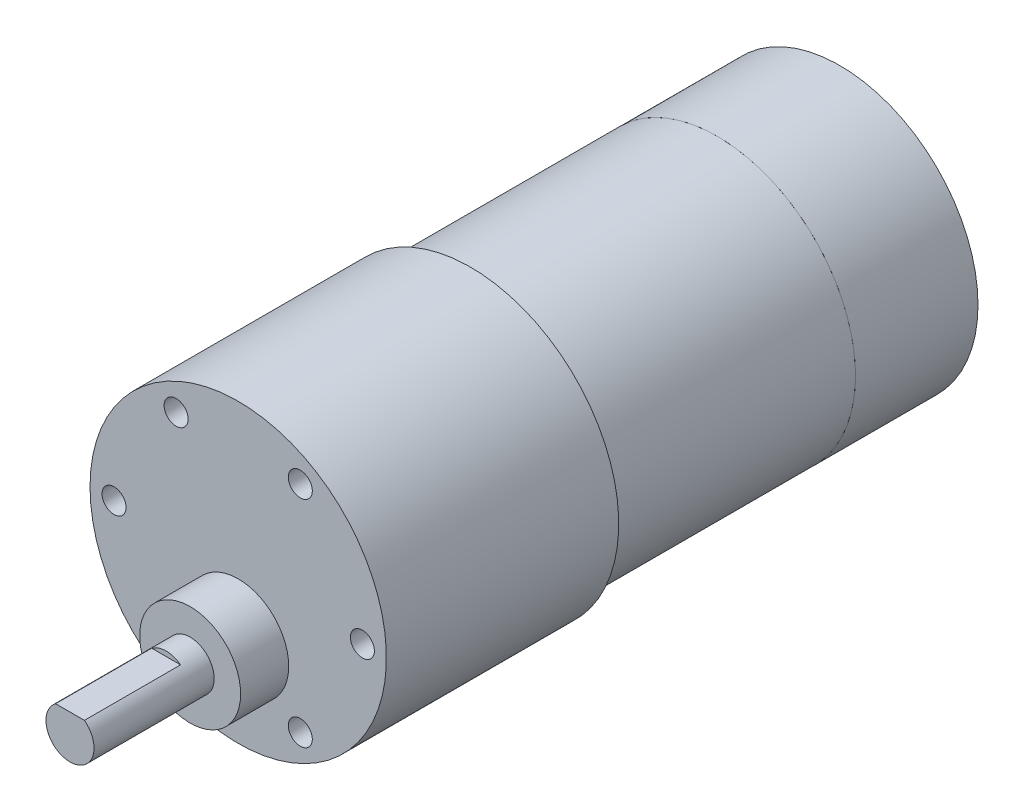
ISO-10303-21;
HEADER;
FILE_DESCRIPTION(('STEP AP214'),'2;1');
FILE_NAME('part.step','',(''),(''),'','','');
FILE_SCHEMA(('AUTOMOTIVE_DESIGN { 1 0 10303 214 1 1 1 1 }'));
ENDSEC;
DATA;
#1=APPLICATION_CONTEXT('core data for automotive mechanical design processes');
#2=APPLICATION_PROTOCOL_DEFINITION('international standard','automotive_design',2000,#1);
#3=PRODUCT_CONTEXT('',#1,'mechanical');
#4=PRODUCT('Part','Part','',(#3));
#5=PRODUCT_RELATED_PRODUCT_CATEGORY('part','',(#4));
#6=PRODUCT_DEFINITION_FORMATION('','',#4);
#7=PRODUCT_DEFINITION_CONTEXT('part definition',#1,'design');
#8=PRODUCT_DEFINITION('design','',#6,#7);
#9=PRODUCT_DEFINITION_SHAPE('','',#8);
#10=(LENGTH_UNIT() NAMED_UNIT(*) SI_UNIT(.MILLI.,.METRE.));
#11=(NAMED_UNIT(*) PLANE_ANGLE_UNIT() SI_UNIT($,.RADIAN.));
#12=(NAMED_UNIT(*) SI_UNIT($,.STERADIAN.) SOLID_ANGLE_UNIT());
#13=UNCERTAINTY_MEASURE_WITH_UNIT(LENGTH_MEASURE(1.E-05),#10,'distance_accuracy_value','');
#14=(GEOMETRIC_REPRESENTATION_CONTEXT(3) GLOBAL_UNCERTAINTY_ASSIGNED_CONTEXT((#13)) GLOBAL_UNIT_ASSIGNED_CONTEXT((#10,
#11,#12)) REPRESENTATION_CONTEXT('',''));
#15=CARTESIAN_POINT('',(0.,0.,0.));
#16=DIRECTION('',(0.,0.,1.));
#17=DIRECTION('',(1.,0.,0.));
#18=AXIS2_PLACEMENT_3D('',#15,#16,#17);
#19=CARTESIAN_POINT('',(-14.528654225032,-2.01102840967923,-5.8));
#20=DIRECTION('',(0.,0.,-1.));
#21=DIRECTION('',(-1.,0.,0.));
#22=AXIS2_PLACEMENT_3D('',#19,#20,#21);
#23=CYLINDRICAL_SURFACE('',#22,17.25);
#24=CARTESIAN_POINT('',(-14.528654225032,-2.01102840967923,-5.8));
#25=DIRECTION('',(0.,0.,1.));
#26=DIRECTION('',(1.,0.,0.));
#27=AXIS2_PLACEMENT_3D('',#24,#25,#26);
#28=CIRCLE('',#27,17.25);
#29=CARTESIAN_POINT('',(2.72134577496796,-2.01102840967923,-5.8));
#30=VERTEX_POINT('',#29);
#31=EDGE_CURVE('P0_E9',#30,#30,#28,.T.);
#32=ORIENTED_EDGE('',*,*,#31,.F.);
#33=EDGE_LOOP('',(#32));
#34=FACE_BOUND('',#33,.T.);
#35=CARTESIAN_POINT('',(-14.528654225032,-2.01102840967923,-21.1));
#36=DIRECTION('',(0.,0.,1.));
#37=DIRECTION('',(1.,0.,0.));
#38=AXIS2_PLACEMENT_3D('',#35,#36,#37);
#39=CIRCLE('',#38,17.25);
#40=CARTESIAN_POINT('',(2.72134577496796,-2.01102840967923,-21.1));
#41=VERTEX_POINT('',#40);
#42=EDGE_CURVE('P0_E16',#41,#41,#39,.T.);
#43=ORIENTED_EDGE('',*,*,#42,.T.);
#44=EDGE_LOOP('',(#43));
#45=FACE_BOUND('',#44,.T.);
#46=ADVANCED_FACE('P0_F13',(#34,#45),#23,.T.);
#47=CARTESIAN_POINT('',(-14.528654225032,-2.01102840967923,-5.8));
#48=DIRECTION('',(0.,0.,1.));
#49=DIRECTION('',(1.,0.,0.));
#50=AXIS2_PLACEMENT_3D('',#47,#48,#49);
#51=PLANE('',#50);
#52=ORIENTED_EDGE('',*,*,#31,.T.);
#53=EDGE_LOOP('',(#52));
#54=FACE_BOUND('',#53,.T.);
#55=ADVANCED_FACE('P0_F28',(#54),#51,.T.);
#56=CARTESIAN_POINT('',(-14.528654225032,-2.01102840967923,-21.1));
#57=DIRECTION('',(0.,0.,1.));
#58=DIRECTION('',(1.,0.,0.));
#59=AXIS2_PLACEMENT_3D('',#56,#57,#58);
#60=PLANE('',#59);
#61=ORIENTED_EDGE('',*,*,#42,.F.);
#62=EDGE_LOOP('',(#61));
#63=FACE_BOUND('',#62,.T.);
#64=ADVANCED_FACE('P0_F26',(#63),#60,.F.);
#65=CLOSED_SHELL('',(#46,#55,#64));
#66=MANIFOLD_SOLID_BREP('P0_B1',#65);
#67=CARTESIAN_POINT('',(-14.528654225032,-2.01102840967923,54.));
#68=DIRECTION('',(0.,0.,-1.));
#69=DIRECTION('',(-1.,0.,0.));
#70=AXIS2_PLACEMENT_3D('',#67,#68,#69);
#71=CYLINDRICAL_SURFACE('',#70,18.5);
#72=CARTESIAN_POINT('',(-14.528654225032,-2.01102840967923,54.));
#73=DIRECTION('',(0.,0.,1.));
#74=DIRECTION('',(1.,0.,0.));
#75=AXIS2_PLACEMENT_3D('',#72,#73,#74);
#76=CIRCLE('',#75,18.5);
#77=CARTESIAN_POINT('',(-33.028654225032,-2.01102840967923,54.));
#78=VERTEX_POINT('',#77);
#79=EDGE_CURVE('P1_E65',#78,#78,#76,.T.);
#80=CARTESIAN_POINT('',(-14.528654225032,-2.01102840967923,25.));
#81=DIRECTION('',(0.,0.,1.));
#82=DIRECTION('',(1.,0.,0.));
#83=AXIS2_PLACEMENT_3D('',#80,#81,#82);
#84=CIRCLE('',#83,18.5);
#85=CARTESIAN_POINT('',(-33.028654225032,-2.01102840967923,25.));
#86=VERTEX_POINT('',#85);
#87=EDGE_CURVE('P1_E56',#86,#86,#84,.T.);
#88=CARTESIAN_POINT('',(-33.028654225032,-2.01102840967923,54.));
#89=CARTESIAN_POINT('',(-33.028654225032,-2.01102840967923,53.6979166666667));
#90=CARTESIAN_POINT('',(-33.028654225032,-2.01102840967923,53.3958333333333));
#91=CARTESIAN_POINT('',(-33.028654225032,-2.01102840967923,52.7916666666667));
#92=CARTESIAN_POINT('',(-33.028654225032,-2.01102840967923,52.4895833333333));
#93=CARTESIAN_POINT('',(-33.028654225032,-2.01102840967923,51.8854166666667));
#94=CARTESIAN_POINT('',(-33.028654225032,-2.01102840967923,51.5833333333333));
#95=CARTESIAN_POINT('',(-33.028654225032,-2.01102840967923,50.9791666666667));
#96=CARTESIAN_POINT('',(-33.028654225032,-2.01102840967923,50.6770833333333));
#97=CARTESIAN_POINT('',(-33.028654225032,-2.01102840967923,50.0729166666667));
#98=CARTESIAN_POINT('',(-33.028654225032,-2.01102840967923,49.7708333333333));
#99=CARTESIAN_POINT('',(-33.028654225032,-2.01102840967923,49.1666666666667));
#100=CARTESIAN_POINT('',(-33.028654225032,-2.01102840967923,48.8645833333333));
#101=CARTESIAN_POINT('',(-33.028654225032,-2.01102840967923,48.2604166666667));
#102=CARTESIAN_POINT('',(-33.028654225032,-2.01102840967923,47.9583333333333));
#103=CARTESIAN_POINT('',(-33.028654225032,-2.01102840967923,47.3541666666667));
#104=CARTESIAN_POINT('',(-33.028654225032,-2.01102840967923,47.0520833333333));
#105=CARTESIAN_POINT('',(-33.028654225032,-2.01102840967923,46.4479166666667));
#106=CARTESIAN_POINT('',(-33.028654225032,-2.01102840967923,46.1458333333333));
#107=CARTESIAN_POINT('',(-33.028654225032,-2.01102840967923,45.5416666666667));
#108=CARTESIAN_POINT('',(-33.028654225032,-2.01102840967923,45.2395833333333));
#109=CARTESIAN_POINT('',(-33.028654225032,-2.01102840967923,44.6354166666667));
#110=CARTESIAN_POINT('',(-33.028654225032,-2.01102840967923,44.3333333333333));
#111=CARTESIAN_POINT('',(-33.028654225032,-2.01102840967923,43.7291666666667));
#112=CARTESIAN_POINT('',(-33.028654225032,-2.01102840967923,43.4270833333333));
#113=CARTESIAN_POINT('',(-33.028654225032,-2.01102840967923,42.8229166666667));
#114=CARTESIAN_POINT('',(-33.028654225032,-2.01102840967923,42.5208333333333));
#115=CARTESIAN_POINT('',(-33.028654225032,-2.01102840967923,41.9166666666667));
#116=CARTESIAN_POINT('',(-33.028654225032,-2.01102840967923,41.6145833333333));
#117=CARTESIAN_POINT('',(-33.028654225032,-2.01102840967923,41.0104166666667));
#118=CARTESIAN_POINT('',(-33.028654225032,-2.01102840967923,40.7083333333333));
#119=CARTESIAN_POINT('',(-33.028654225032,-2.01102840967923,40.1041666666667));
#120=CARTESIAN_POINT('',(-33.028654225032,-2.01102840967923,39.8020833333333));
#121=CARTESIAN_POINT('',(-33.028654225032,-2.01102840967923,39.1979166666667));
#122=CARTESIAN_POINT('',(-33.028654225032,-2.01102840967923,38.8958333333333));
#123=CARTESIAN_POINT('',(-33.028654225032,-2.01102840967923,38.2916666666667));
#124=CARTESIAN_POINT('',(-33.028654225032,-2.01102840967923,37.9895833333333));
#125=CARTESIAN_POINT('',(-33.028654225032,-2.01102840967923,37.3854166666667));
#126=CARTESIAN_POINT('',(-33.028654225032,-2.01102840967923,37.0833333333333));
#127=CARTESIAN_POINT('',(-33.028654225032,-2.01102840967923,36.4791666666667));
#128=CARTESIAN_POINT('',(-33.028654225032,-2.01102840967923,36.1770833333333));
#129=CARTESIAN_POINT('',(-33.028654225032,-2.01102840967923,35.5729166666667));
#130=CARTESIAN_POINT('',(-33.028654225032,-2.01102840967923,35.2708333333333));
#131=CARTESIAN_POINT('',(-33.028654225032,-2.01102840967923,34.6666666666667));
#132=CARTESIAN_POINT('',(-33.028654225032,-2.01102840967923,34.3645833333333));
#133=CARTESIAN_POINT('',(-33.028654225032,-2.01102840967923,33.7604166666667));
#134=CARTESIAN_POINT('',(-33.028654225032,-2.01102840967923,33.4583333333333));
#135=CARTESIAN_POINT('',(-33.028654225032,-2.01102840967923,32.8541666666667));
#136=CARTESIAN_POINT('',(-33.028654225032,-2.01102840967923,32.5520833333333));
#137=CARTESIAN_POINT('',(-33.028654225032,-2.01102840967923,31.9479166666667));
#138=CARTESIAN_POINT('',(-33.028654225032,-2.01102840967923,31.6458333333333));
#139=CARTESIAN_POINT('',(-33.028654225032,-2.01102840967923,31.0416666666667));
#140=CARTESIAN_POINT('',(-33.028654225032,-2.01102840967923,30.7395833333333));
#141=CARTESIAN_POINT('',(-33.028654225032,-2.01102840967923,30.1354166666667));
#142=CARTESIAN_POINT('',(-33.028654225032,-2.01102840967923,29.8333333333333));
#143=CARTESIAN_POINT('',(-33.028654225032,-2.01102840967923,29.2291666666667));
#144=CARTESIAN_POINT('',(-33.028654225032,-2.01102840967923,28.9270833333333));
#145=CARTESIAN_POINT('',(-33.028654225032,-2.01102840967923,28.3229166666667));
#146=CARTESIAN_POINT('',(-33.028654225032,-2.01102840967923,28.0208333333333));
#147=CARTESIAN_POINT('',(-33.028654225032,-2.01102840967923,27.4166666666667));
#148=CARTESIAN_POINT('',(-33.028654225032,-2.01102840967923,27.1145833333333));
#149=CARTESIAN_POINT('',(-33.028654225032,-2.01102840967923,26.5104166666667));
#150=CARTESIAN_POINT('',(-33.028654225032,-2.01102840967923,26.2083333333333));
#151=CARTESIAN_POINT('',(-33.028654225032,-2.01102840967923,25.6041666666667));
#152=CARTESIAN_POINT('',(-33.028654225032,-2.01102840967923,25.3020833333333));
#153=CARTESIAN_POINT('',(-33.028654225032,-2.01102840967923,25.));
#154=B_SPLINE_CURVE_WITH_KNOTS('',3,(#88,#89,#90,#91,#92,#93,#94,#95,#96,#97,#98,#99,#100,#101,
#102,#103,#104,#105,#106,#107,#108,#109,#110,#111,#112,#113,#114,#115,#116,#117,#118,#119,#120,
#121,#122,#123,#124,#125,#126,#127,#128,#129,#130,#131,#132,#133,#134,#135,#136,#137,#138,#139,
#140,#141,#142,#143,#144,#145,#146,#147,#148,#149,#150,#151,#152,#153),.UNSPECIFIED.,.F.,.F.,(4,
2,2,2,2,2,2,2,2,2,2,2,2,2,2,2,2,2,2,2,2,2,2,2,2,2,2,2,2,2,2,2,4),(0.,0.906249999999997,
1.81249999999999,2.71875,3.625,4.53124999999999,5.4375,6.34375,7.25,8.15625,9.06249999999999,
9.96875,10.875,11.78125,12.6875,13.59375,14.5,15.40625,16.3125,17.21875,18.125,19.03125,19.9375,
20.84375,21.75,22.65625,23.5625,24.46875,25.375,26.28125,27.1875,28.09375,29.),.UNSPECIFIED.);
#155=EDGE_CURVE('P1_BSEAM16',#78,#86,#154,.T.);
#156=ORIENTED_EDGE('',*,*,#79,.F.);
#157=ORIENTED_EDGE('',*,*,#87,.T.);
#158=ORIENTED_EDGE('',*,*,#155,.T.);
#159=ORIENTED_EDGE('',*,*,#155,.F.);
#160=EDGE_LOOP('',(#156,#158,#157,#159));
#161=FACE_BOUND('',#160,.T.);
#162=ADVANCED_FACE('P1_F16',(#161),#71,.T.);
#163=CARTESIAN_POINT('',(-14.528654225032,-2.01102840967923,54.));
#164=DIRECTION('',(0.,0.,1.));
#165=DIRECTION('',(1.,0.,0.));
#166=AXIS2_PLACEMENT_3D('',#163,#164,#165);
#167=PLANE('',#166);
#168=CARTESIAN_POINT('',(-30.028654225032,-2.01102840967923,54.));
#169=DIRECTION('',(0.,0.,1.));
#170=DIRECTION('',(1.,0.,0.));
#171=AXIS2_PLACEMENT_3D('',#168,#169,#170);
#172=CIRCLE('',#171,1.5);
#173=CARTESIAN_POINT('',(-28.528654225032,-2.01102840967923,54.));
#174=VERTEX_POINT('',#173);
#175=EDGE_CURVE('P1_E284',#174,#174,#172,.T.);
#176=ORIENTED_EDGE('',*,*,#175,.F.);
#177=EDGE_LOOP('',(#176));
#178=FACE_BOUND('',#177,.T.);
#179=CARTESIAN_POINT('',(0.971345774967963,-2.01102840967923,54.));
#180=DIRECTION('',(0.,0.,1.));
#181=DIRECTION('',(1.,0.,0.));
#182=AXIS2_PLACEMENT_3D('',#179,#180,#181);
#183=CIRCLE('',#182,1.5);
#184=CARTESIAN_POINT('',(2.47134577496796,-2.01102840967923,54.));
#185=VERTEX_POINT('',#184);
#186=EDGE_CURVE('P1_E295',#185,#185,#183,.T.);
#187=ORIENTED_EDGE('',*,*,#186,.F.);
#188=EDGE_LOOP('',(#187));
#189=FACE_BOUND('',#188,.T.);
#190=CARTESIAN_POINT('',(-22.278654225032,11.4123653489794,54.));
#191=DIRECTION('',(0.,0.,1.));
#192=DIRECTION('',(1.,0.,0.));
#193=AXIS2_PLACEMENT_3D('',#190,#191,#192);
#194=CIRCLE('',#193,1.5);
#195=CARTESIAN_POINT('',(-20.778654225032,11.4123653489794,54.));
#196=VERTEX_POINT('',#195);
#197=EDGE_CURVE('P1_E302',#196,#196,#194,.T.);
#198=ORIENTED_EDGE('',*,*,#197,.F.);
#199=EDGE_LOOP('',(#198));
#200=FACE_BOUND('',#199,.T.);
#201=CARTESIAN_POINT('',(-6.77865422503204,11.4123653489794,54.));
#202=DIRECTION('',(0.,0.,1.));
#203=DIRECTION('',(1.,0.,0.));
#204=AXIS2_PLACEMENT_3D('',#201,#202,#203);
#205=CIRCLE('',#204,1.5);
#206=CARTESIAN_POINT('',(-5.27865422503204,11.4123653489794,54.));
#207=VERTEX_POINT('',#206);
#208=EDGE_CURVE('P1_E283',#207,#207,#205,.T.);
#209=ORIENTED_EDGE('',*,*,#208,.F.);
#210=EDGE_LOOP('',(#209));
#211=FACE_BOUND('',#210,.T.);
#212=CARTESIAN_POINT('',(-22.278654225032,-15.4344221683381,54.));
#213=DIRECTION('',(0.,0.,1.));
#214=DIRECTION('',(1.,0.,0.));
#215=AXIS2_PLACEMENT_3D('',#212,#213,#214);
#216=CIRCLE('',#215,1.5);
#217=CARTESIAN_POINT('',(-20.778654225032,-15.4344221683381,54.));
#218=VERTEX_POINT('',#217);
#219=EDGE_CURVE('P1_E310',#218,#218,#216,.T.);
#220=ORIENTED_EDGE('',*,*,#219,.F.);
#221=EDGE_LOOP('',(#220));
#222=FACE_BOUND('',#221,.T.);
#223=CARTESIAN_POINT('',(-6.77865422503204,-15.4344221683381,54.));
#224=DIRECTION('',(0.,0.,1.));
#225=DIRECTION('',(1.,0.,0.));
#226=AXIS2_PLACEMENT_3D('',#223,#224,#225);
#227=CIRCLE('',#226,1.5);
#228=CARTESIAN_POINT('',(-5.27865422503204,-15.4344221683381,54.));
#229=VERTEX_POINT('',#228);
#230=EDGE_CURVE('P1_E301',#229,#229,#227,.T.);
#231=ORIENTED_EDGE('',*,*,#230,.F.);
#232=EDGE_LOOP('',(#231));
#233=FACE_BOUND('',#232,.T.);
#234=CARTESIAN_POINT('',(-14.528654225032,-9.01102840967923,54.));
#235=DIRECTION('',(0.,0.,1.));
#236=DIRECTION('',(1.,0.,0.));
#237=AXIS2_PLACEMENT_3D('',#234,#235,#236);
#238=CIRCLE('',#237,6.3);
#239=CARTESIAN_POINT('',(-8.22865422503204,-9.01102840967923,54.));
#240=VERTEX_POINT('',#239);
#241=EDGE_CURVE('P1_E61',#240,#240,#238,.T.);
#242=ORIENTED_EDGE('',*,*,#241,.F.);
#243=EDGE_LOOP('',(#242));
#244=FACE_BOUND('',#243,.T.);
#245=ORIENTED_EDGE('',*,*,#79,.T.);
#246=EDGE_LOOP('',(#245));
#247=FACE_BOUND('',#246,.T.);
#248=ADVANCED_FACE('P1_F75',(#178,#189,#200,#211,#222,#233,#244,#247),#167,.T.);
#249=CARTESIAN_POINT('',(-14.528654225032,-2.01102840967923,25.));
#250=DIRECTION('',(0.,0.,1.));
#251=DIRECTION('',(1.,0.,0.));
#252=AXIS2_PLACEMENT_3D('',#249,#250,#251);
#253=PLANE('',#252);
#254=ORIENTED_EDGE('',*,*,#87,.F.);
#255=EDGE_LOOP('',(#254));
#256=FACE_BOUND('',#255,.T.);
#257=ADVANCED_FACE('P1_F72',(#256),#253,.F.);
#258=CARTESIAN_POINT('',(-14.528654225032,-9.01102840967923,60.));
#259=DIRECTION('',(0.,0.,-1.));
#260=DIRECTION('',(-1.,0.,0.));
#261=AXIS2_PLACEMENT_3D('',#258,#259,#260);
#262=CYLINDRICAL_SURFACE('',#261,6.3);
#263=CARTESIAN_POINT('',(-14.528654225032,-9.01102840967923,60.));
#264=DIRECTION('',(0.,0.,1.));
#265=DIRECTION('',(1.,0.,0.));
#266=AXIS2_PLACEMENT_3D('',#263,#264,#265);
#267=CIRCLE('',#266,6.3);
#268=CARTESIAN_POINT('',(-8.22865422503204,-9.01102840967923,60.));
#269=VERTEX_POINT('',#268);
#270=EDGE_CURVE('P1_E53',#269,#269,#267,.T.);
#271=ORIENTED_EDGE('',*,*,#270,.F.);
#272=EDGE_LOOP('',(#271));
#273=FACE_BOUND('',#272,.T.);
#274=ORIENTED_EDGE('',*,*,#241,.T.);
#275=EDGE_LOOP('',(#274));
#276=FACE_BOUND('',#275,.T.);
#277=ADVANCED_FACE('P1_F74',(#273,#276),#262,.T.);
#278=CARTESIAN_POINT('',(-14.528654225032,-9.01102840967923,60.));
#279=DIRECTION('',(0.,0.,1.));
#280=DIRECTION('',(1.,0.,0.));
#281=AXIS2_PLACEMENT_3D('',#278,#279,#280);
#282=PLANE('',#281);
#283=CARTESIAN_POINT('',(-14.528654225032,-9.01102840967923,60.));
#284=DIRECTION('',(0.,0.,1.));
#285=DIRECTION('',(1.,0.,0.));
#286=AXIS2_PLACEMENT_3D('',#283,#284,#285);
#287=CIRCLE('',#286,3.);
#288=CARTESIAN_POINT('',(-11.528654225032,-9.01102840967923,60.));
#289=VERTEX_POINT('',#288);
#290=EDGE_CURVE('P1_E44',#289,#289,#287,.T.);
#291=ORIENTED_EDGE('',*,*,#290,.F.);
#292=EDGE_LOOP('',(#291));
#293=FACE_BOUND('',#292,.T.);
#294=ORIENTED_EDGE('',*,*,#270,.T.);
#295=EDGE_LOOP('',(#294));
#296=FACE_BOUND('',#295,.T.);
#297=ADVANCED_FACE('P1_F81',(#293,#296),#282,.T.);
#298=CARTESIAN_POINT('',(-14.528654225032,-9.01102840967923,75.));
#299=DIRECTION('',(0.,0.,-1.));
#300=DIRECTION('',(-1.,0.,0.));
#301=AXIS2_PLACEMENT_3D('',#298,#299,#300);
#302=CYLINDRICAL_SURFACE('',#301,3.);
#303=CARTESIAN_POINT('',(-14.528654225032,-9.01102840967923,75.));
#304=DIRECTION('',(0.,0.,1.));
#305=DIRECTION('',(1.,0.,0.));
#306=AXIS2_PLACEMENT_3D('',#303,#304,#305);
#307=CIRCLE('',#306,3.);
#308=CARTESIAN_POINT('',(-16.328654225032,-6.61102840967923,75.));
#309=VERTEX_POINT('',#308);
#310=CARTESIAN_POINT('',(-12.728654225032,-6.61102840967923,75.));
#311=VERTEX_POINT('',#310);
#312=EDGE_CURVE('P1_E49',#309,#311,#307,.T.);
#313=ORIENTED_EDGE('',*,*,#312,.F.);
#314=DIRECTION('',(0.,0.,-1.));
#315=VECTOR('',#314,1.);
#316=CARTESIAN_POINT('',(-16.328654225032,-6.61102840967923,75.));
#317=LINE('',#316,#315);
#318=CARTESIAN_POINT('',(-16.328654225032,-6.61102840967923,63.));
#319=VERTEX_POINT('',#318);
#320=EDGE_CURVE('P1_E30',#309,#319,#317,.T.);
#321=ORIENTED_EDGE('',*,*,#320,.T.);
#322=CARTESIAN_POINT('',(-14.528654225032,-9.01102840967923,63.));
#323=DIRECTION('',(0.,0.,1.));
#324=DIRECTION('',(1.,0.,0.));
#325=AXIS2_PLACEMENT_3D('',#322,#323,#324);
#326=CIRCLE('',#325,3.);
#327=CARTESIAN_POINT('',(-12.728654225032,-6.61102840967923,63.));
#328=VERTEX_POINT('',#327);
#329=EDGE_CURVE('P1_E11',#328,#319,#326,.T.);
#330=ORIENTED_EDGE('',*,*,#329,.F.);
#331=DIRECTION('',(0.,0.,-1.));
#332=VECTOR('',#331,1.);
#333=CARTESIAN_POINT('',(-12.728654225032,-6.61102840967923,75.));
#334=LINE('',#333,#332);
#335=EDGE_CURVE('P1_E35',#328,#311,#334,.F.);
#336=ORIENTED_EDGE('',*,*,#335,.T.);
#337=EDGE_LOOP('',(#313,#321,#330,#336));
#338=FACE_BOUND('',#337,.T.);
#339=ORIENTED_EDGE('',*,*,#290,.T.);
#340=EDGE_LOOP('',(#339));
#341=FACE_BOUND('',#340,.T.);
#342=ADVANCED_FACE('P1_F47',(#338,#341),#302,.T.);
#343=CARTESIAN_POINT('',(-14.528654225032,-9.01102840967923,75.));
#344=DIRECTION('',(0.,0.,1.));
#345=DIRECTION('',(1.,0.,0.));
#346=AXIS2_PLACEMENT_3D('',#343,#344,#345);
#347=PLANE('',#346);
#348=DIRECTION('',(1.,0.,0.));
#349=VECTOR('',#348,1.);
#350=CARTESIAN_POINT('',(-14.528654225032,-6.61102840967923,75.));
#351=LINE('',#350,#349);
#352=EDGE_CURVE('P1_E23',#309,#311,#351,.T.);
#353=ORIENTED_EDGE('',*,*,#352,.F.);
#354=ORIENTED_EDGE('',*,*,#312,.T.);
#355=EDGE_LOOP('',(#353,#354));
#356=FACE_BOUND('',#355,.T.);
#357=ADVANCED_FACE('P1_F52',(#356),#347,.T.);
#358=CARTESIAN_POINT('',(-14.528654225032,-2.01102840967923,63.));
#359=DIRECTION('',(0.,0.,1.));
#360=DIRECTION('',(1.,0.,0.));
#361=AXIS2_PLACEMENT_3D('',#358,#359,#360);
#362=PLANE('',#361);
#363=ORIENTED_EDGE('',*,*,#329,.T.);
#364=DIRECTION('',(1.,0.,0.));
#365=VECTOR('',#364,1.);
#366=CARTESIAN_POINT('',(-18.4005260818637,-6.61102840967923,63.));
#367=LINE('',#366,#365);
#368=EDGE_CURVE('P1_E50',#319,#328,#367,.T.);
#369=ORIENTED_EDGE('',*,*,#368,.T.);
#370=EDGE_LOOP('',(#363,#369));
#371=FACE_BOUND('',#370,.T.);
#372=ADVANCED_FACE('P1_F137',(#371),#362,.T.);
#373=CARTESIAN_POINT('',(-18.4005260818637,-6.61102840967923,63.));
#374=DIRECTION('',(0.,-1.,0.));
#375=DIRECTION('',(0.,0.,-1.));
#376=AXIS2_PLACEMENT_3D('',#373,#374,#375);
#377=PLANE('',#376);
#378=ORIENTED_EDGE('',*,*,#352,.T.);
#379=ORIENTED_EDGE('',*,*,#335,.F.);
#380=ORIENTED_EDGE('',*,*,#368,.F.);
#381=ORIENTED_EDGE('',*,*,#320,.F.);
#382=EDGE_LOOP('',(#378,#379,#380,#381));
#383=FACE_BOUND('',#382,.T.);
#384=ADVANCED_FACE('P1_F40',(#383),#377,.F.);
#385=CARTESIAN_POINT('',(-6.77865422503204,-15.4344221683381,49.));
#386=DIRECTION('',(0.,0.,1.));
#387=DIRECTION('',(1.,0.,0.));
#388=AXIS2_PLACEMENT_3D('',#385,#386,#387);
#389=CYLINDRICAL_SURFACE('',#388,1.5);
#390=CARTESIAN_POINT('',(-6.77865422503204,-15.4344221683381,49.));
#391=DIRECTION('',(0.,0.,1.));
#392=DIRECTION('',(1.,0.,0.));
#393=AXIS2_PLACEMENT_3D('',#390,#391,#392);
#394=CIRCLE('',#393,1.5);
#395=CARTESIAN_POINT('',(-5.27865422503204,-15.4344221683381,49.));
#396=VERTEX_POINT('',#395);
#397=EDGE_CURVE('P1_E313',#396,#396,#394,.T.);
#398=ORIENTED_EDGE('',*,*,#397,.F.);
#399=EDGE_LOOP('',(#398));
#400=FACE_BOUND('',#399,.T.);
#401=ORIENTED_EDGE('',*,*,#230,.T.);
#402=EDGE_LOOP('',(#401));
#403=FACE_BOUND('',#402,.T.);
#404=ADVANCED_FACE('P1_F155',(#400,#403),#389,.F.);
#405=CARTESIAN_POINT('',(-6.77865422503204,-15.4344221683381,49.));
#406=DIRECTION('',(0.,0.,1.));
#407=DIRECTION('',(1.,0.,0.));
#408=AXIS2_PLACEMENT_3D('',#405,#406,#407);
#409=PLANE('',#408);
#410=ORIENTED_EDGE('',*,*,#397,.T.);
#411=EDGE_LOOP('',(#410));
#412=FACE_BOUND('',#411,.T.);
#413=ADVANCED_FACE('P1_F164',(#412),#409,.T.);
#414=CARTESIAN_POINT('',(-22.278654225032,-15.4344221683381,49.));
#415=DIRECTION('',(0.,0.,1.));
#416=DIRECTION('',(1.,0.,0.));
#417=AXIS2_PLACEMENT_3D('',#414,#415,#416);
#418=CYLINDRICAL_SURFACE('',#417,1.5);
#419=CARTESIAN_POINT('',(-22.278654225032,-15.4344221683381,49.));
#420=DIRECTION('',(0.,0.,1.));
#421=DIRECTION('',(1.,0.,0.));
#422=AXIS2_PLACEMENT_3D('',#419,#420,#421);
#423=CIRCLE('',#422,1.5);
#424=CARTESIAN_POINT('',(-20.778654225032,-15.4344221683381,49.));
#425=VERTEX_POINT('',#424);
#426=EDGE_CURVE('P1_E307',#425,#425,#423,.T.);
#427=ORIENTED_EDGE('',*,*,#426,.F.);
#428=EDGE_LOOP('',(#427));
#429=FACE_BOUND('',#428,.T.);
#430=ORIENTED_EDGE('',*,*,#219,.T.);
#431=EDGE_LOOP('',(#430));
#432=FACE_BOUND('',#431,.T.);
#433=ADVANCED_FACE('P1_F174',(#429,#432),#418,.F.);
#434=CARTESIAN_POINT('',(-22.278654225032,-15.4344221683381,49.));
#435=DIRECTION('',(0.,0.,1.));
#436=DIRECTION('',(1.,0.,0.));
#437=AXIS2_PLACEMENT_3D('',#434,#435,#436);
#438=PLANE('',#437);
#439=ORIENTED_EDGE('',*,*,#426,.T.);
#440=EDGE_LOOP('',(#439));
#441=FACE_BOUND('',#440,.T.);
#442=ADVANCED_FACE('P1_F184',(#441),#438,.T.);
#443=CARTESIAN_POINT('',(-6.77865422503204,11.4123653489794,49.));
#444=DIRECTION('',(0.,0.,1.));
#445=DIRECTION('',(1.,0.,0.));
#446=AXIS2_PLACEMENT_3D('',#443,#444,#445);
#447=CYLINDRICAL_SURFACE('',#446,1.5);
#448=CARTESIAN_POINT('',(-6.77865422503204,11.4123653489794,49.));
#449=DIRECTION('',(0.,0.,1.));
#450=DIRECTION('',(1.,0.,0.));
#451=AXIS2_PLACEMENT_3D('',#448,#449,#450);
#452=CIRCLE('',#451,1.5);
#453=CARTESIAN_POINT('',(-5.27865422503204,11.4123653489794,49.));
#454=VERTEX_POINT('',#453);
#455=EDGE_CURVE('P1_E287',#454,#454,#452,.T.);
#456=ORIENTED_EDGE('',*,*,#455,.F.);
#457=EDGE_LOOP('',(#456));
#458=FACE_BOUND('',#457,.T.);
#459=ORIENTED_EDGE('',*,*,#208,.T.);
#460=EDGE_LOOP('',(#459));
#461=FACE_BOUND('',#460,.T.);
#462=ADVANCED_FACE('P1_F194',(#458,#461),#447,.F.);
#463=CARTESIAN_POINT('',(-6.77865422503204,11.4123653489794,49.));
#464=DIRECTION('',(0.,0.,1.));
#465=DIRECTION('',(1.,0.,0.));
#466=AXIS2_PLACEMENT_3D('',#463,#464,#465);
#467=PLANE('',#466);
#468=ORIENTED_EDGE('',*,*,#455,.T.);
#469=EDGE_LOOP('',(#468));
#470=FACE_BOUND('',#469,.T.);
#471=ADVANCED_FACE('P1_F204',(#470),#467,.T.);
#472=CARTESIAN_POINT('',(-22.278654225032,11.4123653489794,49.));
#473=DIRECTION('',(0.,0.,1.));
#474=DIRECTION('',(1.,0.,0.));
#475=AXIS2_PLACEMENT_3D('',#472,#473,#474);
#476=CYLINDRICAL_SURFACE('',#475,1.5);
#477=CARTESIAN_POINT('',(-22.278654225032,11.4123653489794,49.));
#478=DIRECTION('',(0.,0.,1.));
#479=DIRECTION('',(1.,0.,0.));
#480=AXIS2_PLACEMENT_3D('',#477,#478,#479);
#481=CIRCLE('',#480,1.5);
#482=CARTESIAN_POINT('',(-20.778654225032,11.4123653489794,49.));
#483=VERTEX_POINT('',#482);
#484=EDGE_CURVE('P1_E298',#483,#483,#481,.T.);
#485=ORIENTED_EDGE('',*,*,#484,.F.);
#486=EDGE_LOOP('',(#485));
#487=FACE_BOUND('',#486,.T.);
#488=ORIENTED_EDGE('',*,*,#197,.T.);
#489=EDGE_LOOP('',(#488));
#490=FACE_BOUND('',#489,.T.);
#491=ADVANCED_FACE('P1_F214',(#487,#490),#476,.F.);
#492=CARTESIAN_POINT('',(-22.278654225032,11.4123653489794,49.));
#493=DIRECTION('',(0.,0.,1.));
#494=DIRECTION('',(1.,0.,0.));
#495=AXIS2_PLACEMENT_3D('',#492,#493,#494);
#496=PLANE('',#495);
#497=ORIENTED_EDGE('',*,*,#484,.T.);
#498=EDGE_LOOP('',(#497));
#499=FACE_BOUND('',#498,.T.);
#500=ADVANCED_FACE('P1_F224',(#499),#496,.T.);
#501=CARTESIAN_POINT('',(0.971345774967963,-2.01102840967923,49.));
#502=DIRECTION('',(0.,0.,1.));
#503=DIRECTION('',(1.,0.,0.));
#504=AXIS2_PLACEMENT_3D('',#501,#502,#503);
#505=CYLINDRICAL_SURFACE('',#504,1.5);
#506=CARTESIAN_POINT('',(0.971345774967963,-2.01102840967923,49.));
#507=DIRECTION('',(0.,0.,1.));
#508=DIRECTION('',(1.,0.,0.));
#509=AXIS2_PLACEMENT_3D('',#506,#507,#508);
#510=CIRCLE('',#509,1.5);
#511=CARTESIAN_POINT('',(2.47134577496796,-2.01102840967923,49.));
#512=VERTEX_POINT('',#511);
#513=EDGE_CURVE('P1_E290',#512,#512,#510,.T.);
#514=ORIENTED_EDGE('',*,*,#513,.F.);
#515=EDGE_LOOP('',(#514));
#516=FACE_BOUND('',#515,.T.);
#517=ORIENTED_EDGE('',*,*,#186,.T.);
#518=EDGE_LOOP('',(#517));
#519=FACE_BOUND('',#518,.T.);
#520=ADVANCED_FACE('P1_F234',(#516,#519),#505,.F.);
#521=CARTESIAN_POINT('',(0.971345774967963,-2.01102840967923,49.));
#522=DIRECTION('',(0.,0.,1.));
#523=DIRECTION('',(1.,0.,0.));
#524=AXIS2_PLACEMENT_3D('',#521,#522,#523);
#525=PLANE('',#524);
#526=ORIENTED_EDGE('',*,*,#513,.T.);
#527=EDGE_LOOP('',(#526));
#528=FACE_BOUND('',#527,.T.);
#529=ADVANCED_FACE('P1_F244',(#528),#525,.T.);
#530=CARTESIAN_POINT('',(-30.028654225032,-2.01102840967923,49.));
#531=DIRECTION('',(0.,0.,1.));
#532=DIRECTION('',(1.,0.,0.));
#533=AXIS2_PLACEMENT_3D('',#530,#531,#532);
#534=CYLINDRICAL_SURFACE('',#533,1.5);
#535=CARTESIAN_POINT('',(-30.028654225032,-2.01102840967923,49.));
#536=DIRECTION('',(0.,0.,1.));
#537=DIRECTION('',(1.,0.,0.));
#538=AXIS2_PLACEMENT_3D('',#535,#536,#537);
#539=CIRCLE('',#538,1.5);
#540=CARTESIAN_POINT('',(-28.528654225032,-2.01102840967923,49.));
#541=VERTEX_POINT('',#540);
#542=EDGE_CURVE('P1_E282',#541,#541,#539,.T.);
#543=ORIENTED_EDGE('',*,*,#542,.F.);
#544=EDGE_LOOP('',(#543));
#545=FACE_BOUND('',#544,.T.);
#546=ORIENTED_EDGE('',*,*,#175,.T.);
#547=EDGE_LOOP('',(#546));
#548=FACE_BOUND('',#547,.T.);
#549=ADVANCED_FACE('P1_F254',(#545,#548),#534,.F.);
#550=CARTESIAN_POINT('',(-30.028654225032,-2.01102840967923,49.));
#551=DIRECTION('',(0.,0.,1.));
#552=DIRECTION('',(1.,0.,0.));
#553=AXIS2_PLACEMENT_3D('',#550,#551,#552);
#554=PLANE('',#553);
#555=ORIENTED_EDGE('',*,*,#542,.T.);
#556=EDGE_LOOP('',(#555));
#557=FACE_BOUND('',#556,.T.);
#558=ADVANCED_FACE('P1_F264',(#557),#554,.T.);
#559=CLOSED_SHELL('',(#162,#248,#257,#277,#297,#342,#357,#372,#384,#404,#413,#433,#442,#462,
#471,#491,#500,#520,#529,#549,#558));
#560=MANIFOLD_SOLID_BREP('P1_B1',#559);
#561=CARTESIAN_POINT('',(-14.528654225032,-2.01102840967923,25.));
#562=DIRECTION('',(0.,0.,-1.));
#563=DIRECTION('',(-1.,0.,0.));
#564=AXIS2_PLACEMENT_3D('',#561,#562,#563);
#565=CYLINDRICAL_SURFACE('',#564,17.25);
#566=CARTESIAN_POINT('',(-14.528654225032,-2.01102840967923,25.));
#567=DIRECTION('',(0.,0.,1.));
#568=DIRECTION('',(1.,0.,0.));
#569=AXIS2_PLACEMENT_3D('',#566,#567,#568);
#570=CIRCLE('',#569,17.25);
#571=CARTESIAN_POINT('',(-31.778654225032,-2.01102840967923,25.));
#572=VERTEX_POINT('',#571);
#573=EDGE_CURVE('P2_E9',#572,#572,#570,.T.);
#574=CARTESIAN_POINT('',(-14.528654225032,-2.01102840967923,-5.8));
#575=DIRECTION('',(0.,0.,1.));
#576=DIRECTION('',(1.,0.,0.));
#577=AXIS2_PLACEMENT_3D('',#574,#575,#576);
#578=CIRCLE('',#577,17.25);
#579=CARTESIAN_POINT('',(-31.778654225032,-2.01102840967923,-5.8));
#580=VERTEX_POINT('',#579);
#581=EDGE_CURVE('P2_E16',#580,#580,#578,.T.);
#582=CARTESIAN_POINT('',(-31.778654225032,-2.01102840967923,25.));
#583=CARTESIAN_POINT('',(-31.778654225032,-2.01102840967923,24.6791666666667));
#584=CARTESIAN_POINT('',(-31.778654225032,-2.01102840967923,24.3583333333333));
#585=CARTESIAN_POINT('',(-31.778654225032,-2.01102840967923,23.7166666666667));
#586=CARTESIAN_POINT('',(-31.778654225032,-2.01102840967923,23.3958333333333));
#587=CARTESIAN_POINT('',(-31.778654225032,-2.01102840967923,22.7541666666667));
#588=CARTESIAN_POINT('',(-31.778654225032,-2.01102840967923,22.4333333333333));
#589=CARTESIAN_POINT('',(-31.778654225032,-2.01102840967923,21.7916666666667));
#590=CARTESIAN_POINT('',(-31.778654225032,-2.01102840967923,21.4708333333333));
#591=CARTESIAN_POINT('',(-31.778654225032,-2.01102840967923,20.8291666666667));
#592=CARTESIAN_POINT('',(-31.778654225032,-2.01102840967923,20.5083333333333));
#593=CARTESIAN_POINT('',(-31.778654225032,-2.01102840967923,19.8666666666667));
#594=CARTESIAN_POINT('',(-31.778654225032,-2.01102840967923,19.5458333333333));
#595=CARTESIAN_POINT('',(-31.778654225032,-2.01102840967923,18.9041666666667));
#596=CARTESIAN_POINT('',(-31.778654225032,-2.01102840967923,18.5833333333333));
#597=CARTESIAN_POINT('',(-31.778654225032,-2.01102840967923,17.9416666666667));
#598=CARTESIAN_POINT('',(-31.778654225032,-2.01102840967923,17.6208333333333));
#599=CARTESIAN_POINT('',(-31.778654225032,-2.01102840967923,16.9791666666667));
#600=CARTESIAN_POINT('',(-31.778654225032,-2.01102840967923,16.6583333333333));
#601=CARTESIAN_POINT('',(-31.778654225032,-2.01102840967923,16.0166666666667));
#602=CARTESIAN_POINT('',(-31.778654225032,-2.01102840967923,15.6958333333333));
#603=CARTESIAN_POINT('',(-31.778654225032,-2.01102840967923,15.0541666666667));
#604=CARTESIAN_POINT('',(-31.778654225032,-2.01102840967923,14.7333333333333));
#605=CARTESIAN_POINT('',(-31.778654225032,-2.01102840967923,14.0916666666667));
#606=CARTESIAN_POINT('',(-31.778654225032,-2.01102840967923,13.7708333333333));
#607=CARTESIAN_POINT('',(-31.778654225032,-2.01102840967923,13.1291666666667));
#608=CARTESIAN_POINT('',(-31.778654225032,-2.01102840967923,12.8083333333333));
#609=CARTESIAN_POINT('',(-31.778654225032,-2.01102840967923,12.1666666666667));
#610=CARTESIAN_POINT('',(-31.778654225032,-2.01102840967923,11.8458333333333));
#611=CARTESIAN_POINT('',(-31.778654225032,-2.01102840967923,11.2041666666667));
#612=CARTESIAN_POINT('',(-31.778654225032,-2.01102840967923,10.8833333333333));
#613=CARTESIAN_POINT('',(-31.778654225032,-2.01102840967923,10.2416666666667));
#614=CARTESIAN_POINT('',(-31.778654225032,-2.01102840967923,9.92083333333333));
#615=CARTESIAN_POINT('',(-31.778654225032,-2.01102840967923,9.27916666666667));
#616=CARTESIAN_POINT('',(-31.778654225032,-2.01102840967923,8.95833333333333));
#617=CARTESIAN_POINT('',(-31.778654225032,-2.01102840967923,8.31666666666666));
#618=CARTESIAN_POINT('',(-31.778654225032,-2.01102840967923,7.99583333333333));
#619=CARTESIAN_POINT('',(-31.778654225032,-2.01102840967923,7.35416666666667));
#620=CARTESIAN_POINT('',(-31.778654225032,-2.01102840967923,7.03333333333333));
#621=CARTESIAN_POINT('',(-31.778654225032,-2.01102840967923,6.39166666666667));
#622=CARTESIAN_POINT('',(-31.778654225032,-2.01102840967923,6.07083333333333));
#623=CARTESIAN_POINT('',(-31.778654225032,-2.01102840967923,5.42916666666667));
#624=CARTESIAN_POINT('',(-31.778654225032,-2.01102840967923,5.10833333333333));
#625=CARTESIAN_POINT('',(-31.778654225032,-2.01102840967923,4.46666666666667));
#626=CARTESIAN_POINT('',(-31.778654225032,-2.01102840967923,4.14583333333333));
#627=CARTESIAN_POINT('',(-31.778654225032,-2.01102840967923,3.50416666666667));
#628=CARTESIAN_POINT('',(-31.778654225032,-2.01102840967923,3.18333333333333));
#629=CARTESIAN_POINT('',(-31.778654225032,-2.01102840967923,2.54166666666666));
#630=CARTESIAN_POINT('',(-31.778654225032,-2.01102840967923,2.22083333333333));
#631=CARTESIAN_POINT('',(-31.778654225032,-2.01102840967923,1.57916666666667));
#632=CARTESIAN_POINT('',(-31.778654225032,-2.01102840967923,1.25833333333333));
#633=CARTESIAN_POINT('',(-31.778654225032,-2.01102840967923,0.616666666666665));
#634=CARTESIAN_POINT('',(-31.778654225032,-2.01102840967923,0.295833333333332));
#635=CARTESIAN_POINT('',(-31.778654225032,-2.01102840967923,-0.345833333333335));
#636=CARTESIAN_POINT('',(-31.778654225032,-2.01102840967923,-0.666666666666669));
#637=CARTESIAN_POINT('',(-31.778654225032,-2.01102840967923,-1.30833333333334));
#638=CARTESIAN_POINT('',(-31.778654225032,-2.01102840967923,-1.62916666666667));
#639=CARTESIAN_POINT('',(-31.778654225032,-2.01102840967923,-2.27083333333334));
#640=CARTESIAN_POINT('',(-31.778654225032,-2.01102840967923,-2.59166666666667));
#641=CARTESIAN_POINT('',(-31.778654225032,-2.01102840967923,-3.23333333333334));
#642=CARTESIAN_POINT('',(-31.778654225032,-2.01102840967923,-3.55416666666667));
#643=CARTESIAN_POINT('',(-31.778654225032,-2.01102840967923,-4.19583333333334));
#644=CARTESIAN_POINT('',(-31.778654225032,-2.01102840967923,-4.51666666666667));
#645=CARTESIAN_POINT('',(-31.778654225032,-2.01102840967923,-5.15833333333333));
#646=CARTESIAN_POINT('',(-31.778654225032,-2.01102840967923,-5.47916666666667));
#647=CARTESIAN_POINT('',(-31.778654225032,-2.01102840967923,-5.8));
#648=B_SPLINE_CURVE_WITH_KNOTS('',3,(#582,#583,#584,#585,#586,#587,#588,#589,#590,#591,#592,
#593,#594,#595,#596,#597,#598,#599,#600,#601,#602,#603,#604,#605,#606,#607,#608,#609,#610,#611,
#612,#613,#614,#615,#616,#617,#618,#619,#620,#621,#622,#623,#624,#625,#626,#627,#628,#629,#630,
#631,#632,#633,#634,#635,#636,#637,#638,#639,#640,#641,#642,#643,#644,#645,#646,#647),
.UNSPECIFIED.,.F.,.F.,(4,2,2,2,2,2,2,2,2,2,2,2,2,2,2,2,2,2,2,2,2,2,2,2,2,2,2,2,2,2,2,2,4),(0.,
0.962499999999998,1.925,2.8875,3.85,4.8125,5.775,6.7375,7.7,8.6625,9.625,10.5875,11.55,12.5125,
13.475,14.4375,15.4,16.3625,17.325,18.2875,19.25,20.2125,21.175,22.1375,23.1,24.0625,25.025,
25.9875,26.95,27.9125,28.875,29.8375,30.8),.UNSPECIFIED.);
#649=EDGE_CURVE('P2_BSEAM13',#572,#580,#648,.T.);
#650=ORIENTED_EDGE('',*,*,#573,.F.);
#651=ORIENTED_EDGE('',*,*,#581,.T.);
#652=ORIENTED_EDGE('',*,*,#649,.T.);
#653=ORIENTED_EDGE('',*,*,#649,.F.);
#654=EDGE_LOOP('',(#650,#652,#651,#653));
#655=FACE_BOUND('',#654,.T.);
#656=ADVANCED_FACE('P2_F13',(#655),#565,.T.);
#657=CARTESIAN_POINT('',(-14.528654225032,-2.01102840967923,25.));
#658=DIRECTION('',(0.,0.,1.));
#659=DIRECTION('',(1.,0.,0.));
#660=AXIS2_PLACEMENT_3D('',#657,#658,#659);
#661=PLANE('',#660);
#662=ORIENTED_EDGE('',*,*,#573,.T.);
#663=EDGE_LOOP('',(#662));
#664=FACE_BOUND('',#663,.T.);
#665=ADVANCED_FACE('P2_F28',(#664),#661,.T.);
#666=CARTESIAN_POINT('',(-14.528654225032,-2.01102840967923,-5.8));
#667=DIRECTION('',(0.,0.,1.));
#668=DIRECTION('',(1.,0.,0.));
#669=AXIS2_PLACEMENT_3D('',#666,#667,#668);
#670=PLANE('',#669);
#671=ORIENTED_EDGE('',*,*,#581,.F.);
#672=EDGE_LOOP('',(#671));
#673=FACE_BOUND('',#672,.T.);
#674=ADVANCED_FACE('P2_F26',(#673),#670,.F.);
#675=CLOSED_SHELL('',(#656,#665,#674));
#676=MANIFOLD_SOLID_BREP('P2_B1',#675);
#677=ADVANCED_BREP_SHAPE_REPRESENTATION('',(#18,#66,#560,#676),#14);
#678=SHAPE_DEFINITION_REPRESENTATION(#9,#677);
ENDSEC;
END-ISO-10303-21;
